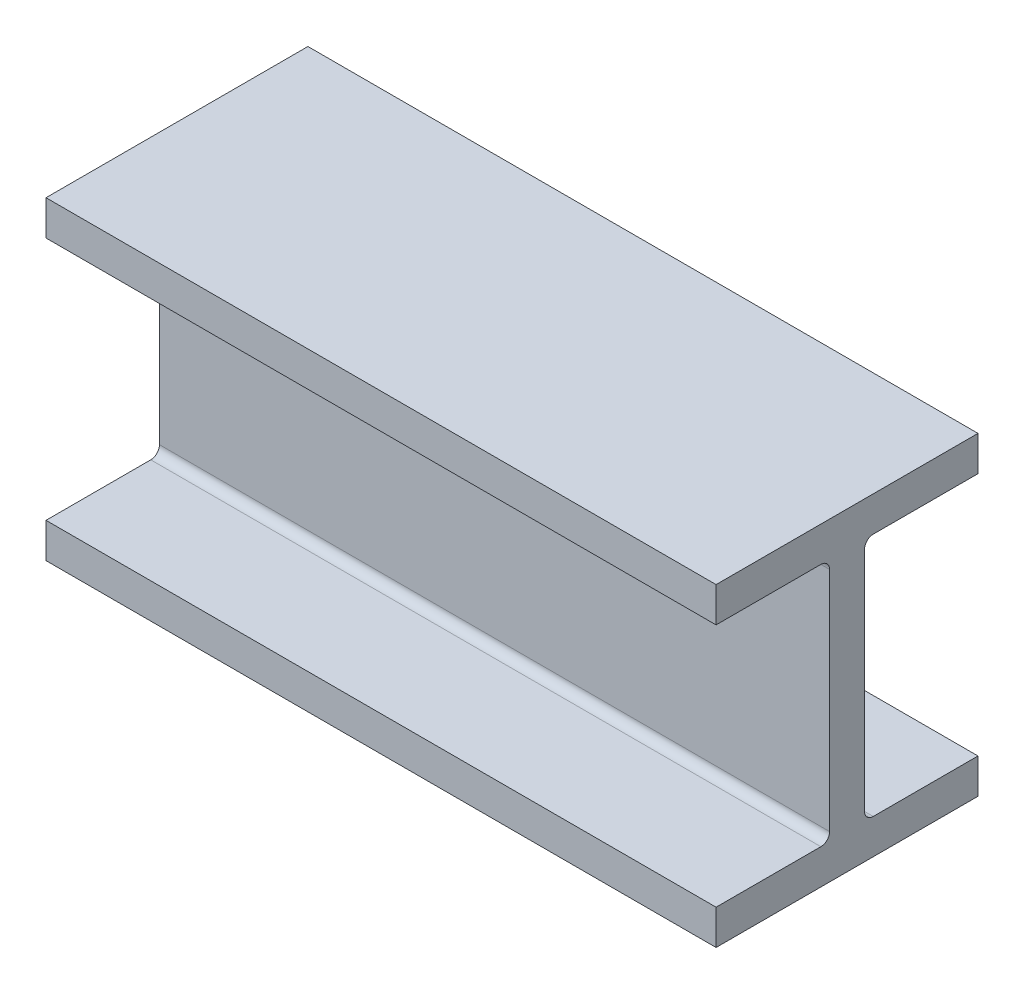
ISO-10303-21;
HEADER;
FILE_DESCRIPTION(('STEP AP214'),'2;1');
FILE_NAME('part.step','',(''),(''),'','','');
FILE_SCHEMA(('AUTOMOTIVE_DESIGN { 1 0 10303 214 1 1 1 1 }'));
ENDSEC;
DATA;
#1=APPLICATION_CONTEXT('core data for automotive mechanical design processes');
#2=APPLICATION_PROTOCOL_DEFINITION('international standard','automotive_design',2000,#1);
#3=PRODUCT_CONTEXT('',#1,'mechanical');
#4=PRODUCT('Part','Part','',(#3));
#5=PRODUCT_RELATED_PRODUCT_CATEGORY('part','',(#4));
#6=PRODUCT_DEFINITION_FORMATION('','',#4);
#7=PRODUCT_DEFINITION_CONTEXT('part definition',#1,'design');
#8=PRODUCT_DEFINITION('design','',#6,#7);
#9=PRODUCT_DEFINITION_SHAPE('','',#8);
#10=(LENGTH_UNIT() NAMED_UNIT(*) SI_UNIT(.MILLI.,.METRE.));
#11=(NAMED_UNIT(*) PLANE_ANGLE_UNIT() SI_UNIT($,.RADIAN.));
#12=(NAMED_UNIT(*) SI_UNIT($,.STERADIAN.) SOLID_ANGLE_UNIT());
#13=UNCERTAINTY_MEASURE_WITH_UNIT(LENGTH_MEASURE(1.E-05),#10,'distance_accuracy_value','');
#14=(GEOMETRIC_REPRESENTATION_CONTEXT(3) GLOBAL_UNCERTAINTY_ASSIGNED_CONTEXT((#13)) GLOBAL_UNIT_ASSIGNED_CONTEXT((#10,
#11,#12)) REPRESENTATION_CONTEXT('',''));
#15=CARTESIAN_POINT('',(0.,0.,0.));
#16=DIRECTION('',(0.,0.,1.));
#17=DIRECTION('',(1.,0.,0.));
#18=AXIS2_PLACEMENT_3D('',#15,#16,#17);
#19=CARTESIAN_POINT('',(1010.,2667.5,150.));
#20=DIRECTION('',(-1.,0.,0.));
#21=DIRECTION('',(0.,0.,1.));
#22=AXIS2_PLACEMENT_3D('',#19,#20,#21);
#23=PLANE('',#22);
#24=DIRECTION('',(0.,0.,1.));
#25=VECTOR('',#24,1.);
#26=CARTESIAN_POINT('',(1010.,2387.5,-20.));
#27=LINE('',#26,#25);
#28=CARTESIAN_POINT('',(1010.,2387.5,-150.));
#29=VERTEX_POINT('',#28);
#30=CARTESIAN_POINT('',(1010.,2387.5,-30.));
#31=VERTEX_POINT('',#30);
#32=EDGE_CURVE('E230',#29,#31,#27,.T.);
#33=ORIENTED_EDGE('',*,*,#32,.T.);
#34=CARTESIAN_POINT('',(1010.,2397.5,-30.));
#35=DIRECTION('',(1.,0.,0.));
#36=DIRECTION('',(0.,0.,-1.));
#37=AXIS2_PLACEMENT_3D('',#34,#35,#36);
#38=CIRCLE('',#37,10.);
#39=CARTESIAN_POINT('',(1010.,2397.5,-20.));
#40=VERTEX_POINT('',#39);
#41=EDGE_CURVE('E258',#31,#40,#38,.F.);
#42=ORIENTED_EDGE('',*,*,#41,.T.);
#43=DIRECTION('',(0.,1.,0.));
#44=VECTOR('',#43,1.);
#45=CARTESIAN_POINT('',(1010.,2387.5,-20.));
#46=LINE('',#45,#44);
#47=CARTESIAN_POINT('',(1010.,2657.5,-20.));
#48=VERTEX_POINT('',#47);
#49=EDGE_CURVE('E234',#40,#48,#46,.T.);
#50=ORIENTED_EDGE('',*,*,#49,.T.);
#51=CARTESIAN_POINT('',(1010.,2657.5,-30.));
#52=DIRECTION('',(1.,0.,0.));
#53=DIRECTION('',(0.,0.,-1.));
#54=AXIS2_PLACEMENT_3D('',#51,#52,#53);
#55=CIRCLE('',#54,10.);
#56=CARTESIAN_POINT('',(1010.,2667.5,-30.));
#57=VERTEX_POINT('',#56);
#58=EDGE_CURVE('E262',#48,#57,#55,.F.);
#59=ORIENTED_EDGE('',*,*,#58,.T.);
#60=DIRECTION('',(0.,0.,-1.));
#61=VECTOR('',#60,1.);
#62=CARTESIAN_POINT('',(1010.,2667.5,-20.));
#63=LINE('',#62,#61);
#64=CARTESIAN_POINT('',(1010.,2667.5,-150.));
#65=VERTEX_POINT('',#64);
#66=EDGE_CURVE('E238',#57,#65,#63,.T.);
#67=ORIENTED_EDGE('',*,*,#66,.T.);
#68=DIRECTION('',(0.,-1.,0.));
#69=VECTOR('',#68,1.);
#70=CARTESIAN_POINT('',(1010.,2347.5,-150.));
#71=LINE('',#70,#69);
#72=CARTESIAN_POINT('',(1010.,2707.5,-150.));
#73=VERTEX_POINT('',#72);
#74=EDGE_CURVE('E217',#73,#65,#71,.T.);
#75=ORIENTED_EDGE('',*,*,#74,.F.);
#76=DIRECTION('',(0.,0.,1.));
#77=VECTOR('',#76,1.);
#78=CARTESIAN_POINT('',(1010.,2707.5,150.));
#79=LINE('',#78,#77);
#80=CARTESIAN_POINT('',(1010.,2707.5,150.));
#81=VERTEX_POINT('',#80);
#82=EDGE_CURVE('E220',#73,#81,#79,.T.);
#83=ORIENTED_EDGE('',*,*,#82,.T.);
#84=DIRECTION('',(0.,1.,0.));
#85=VECTOR('',#84,1.);
#86=CARTESIAN_POINT('',(1010.,2347.5,150.));
#87=LINE('',#86,#85);
#88=CARTESIAN_POINT('',(1010.,2667.5,150.));
#89=VERTEX_POINT('',#88);
#90=EDGE_CURVE('E221',#89,#81,#87,.T.);
#91=ORIENTED_EDGE('',*,*,#90,.F.);
#92=DIRECTION('',(0.,0.,-1.));
#93=VECTOR('',#92,1.);
#94=CARTESIAN_POINT('',(1010.,2667.5,150.));
#95=LINE('',#94,#93);
#96=CARTESIAN_POINT('',(1010.,2667.5,30.));
#97=VERTEX_POINT('',#96);
#98=EDGE_CURVE('E242',#89,#97,#95,.T.);
#99=ORIENTED_EDGE('',*,*,#98,.T.);
#100=CARTESIAN_POINT('',(1010.,2657.5,30.));
#101=DIRECTION('',(1.,0.,0.));
#102=DIRECTION('',(0.,0.,-1.));
#103=AXIS2_PLACEMENT_3D('',#100,#101,#102);
#104=CIRCLE('',#103,10.);
#105=CARTESIAN_POINT('',(1010.,2657.5,20.));
#106=VERTEX_POINT('',#105);
#107=EDGE_CURVE('E265',#97,#106,#104,.F.);
#108=ORIENTED_EDGE('',*,*,#107,.T.);
#109=DIRECTION('',(0.,-1.,0.));
#110=VECTOR('',#109,1.);
#111=CARTESIAN_POINT('',(1010.,2387.5,20.));
#112=LINE('',#111,#110);
#113=CARTESIAN_POINT('',(1010.,2397.5,20.));
#114=VERTEX_POINT('',#113);
#115=EDGE_CURVE('E246',#106,#114,#112,.T.);
#116=ORIENTED_EDGE('',*,*,#115,.T.);
#117=CARTESIAN_POINT('',(1010.,2397.5,30.));
#118=DIRECTION('',(1.,0.,0.));
#119=DIRECTION('',(0.,0.,-1.));
#120=AXIS2_PLACEMENT_3D('',#117,#118,#119);
#121=CIRCLE('',#120,10.);
#122=CARTESIAN_POINT('',(1010.,2387.5,30.));
#123=VERTEX_POINT('',#122);
#124=EDGE_CURVE('E254',#114,#123,#121,.F.);
#125=ORIENTED_EDGE('',*,*,#124,.T.);
#126=DIRECTION('',(0.,0.,1.));
#127=VECTOR('',#126,1.);
#128=CARTESIAN_POINT('',(1010.,2387.5,150.));
#129=LINE('',#128,#127);
#130=CARTESIAN_POINT('',(1010.,2387.5,150.));
#131=VERTEX_POINT('',#130);
#132=EDGE_CURVE('E250',#123,#131,#129,.T.);
#133=ORIENTED_EDGE('',*,*,#132,.T.);
#134=CARTESIAN_POINT('',(1010.,2347.5,150.));
#135=VERTEX_POINT('',#134);
#136=EDGE_CURVE('E224',#135,#131,#87,.T.);
#137=ORIENTED_EDGE('',*,*,#136,.F.);
#138=DIRECTION('',(0.,0.,-1.));
#139=VECTOR('',#138,1.);
#140=CARTESIAN_POINT('',(1010.,2347.5,150.));
#141=LINE('',#140,#139);
#142=CARTESIAN_POINT('',(1010.,2347.5,-150.));
#143=VERTEX_POINT('',#142);
#144=EDGE_CURVE('E172',#135,#143,#141,.T.);
#145=ORIENTED_EDGE('',*,*,#144,.T.);
#146=EDGE_CURVE('E61',#29,#143,#71,.T.);
#147=ORIENTED_EDGE('',*,*,#146,.F.);
#148=EDGE_LOOP('',(#33,#42,#50,#59,#67,#75,#83,#91,#99,#108,#116,#125,#133,#137,#145,#147));
#149=FACE_BOUND('',#148,.T.);
#150=ADVANCED_FACE('F38',(#149),#23,.F.);
#151=CARTESIAN_POINT('',(1010.,2387.5,20.));
#152=DIRECTION('',(0.,0.,-1.));
#153=DIRECTION('',(-1.,0.,0.));
#154=AXIS2_PLACEMENT_3D('',#151,#152,#153);
#155=PLANE('',#154);
#156=DIRECTION('',(-1.,0.,0.));
#157=VECTOR('',#156,1.);
#158=CARTESIAN_POINT('',(160.,2657.5,20.));
#159=LINE('',#158,#157);
#160=CARTESIAN_POINT('',(242.5,2657.5,20.));
#161=VERTEX_POINT('',#160);
#162=EDGE_CURVE('E194',#106,#161,#159,.T.);
#163=ORIENTED_EDGE('',*,*,#162,.T.);
#164=DIRECTION('',(0.,-1.,0.));
#165=VECTOR('',#164,1.);
#166=CARTESIAN_POINT('',(242.5,2387.5,20.));
#167=LINE('',#166,#165);
#168=CARTESIAN_POINT('',(242.5,2397.5,20.));
#169=VERTEX_POINT('',#168);
#170=EDGE_CURVE('E303',#161,#169,#167,.T.);
#171=ORIENTED_EDGE('',*,*,#170,.T.);
#172=DIRECTION('',(-1.,0.,0.));
#173=VECTOR('',#172,1.);
#174=CARTESIAN_POINT('',(1010.,2397.5,20.));
#175=LINE('',#174,#173);
#176=EDGE_CURVE('E198',#169,#114,#175,.F.);
#177=ORIENTED_EDGE('',*,*,#176,.T.);
#178=ORIENTED_EDGE('',*,*,#115,.F.);
#179=EDGE_LOOP('',(#163,#171,#177,#178));
#180=FACE_BOUND('',#179,.T.);
#181=ADVANCED_FACE('F350',(#180),#155,.F.);
#182=CARTESIAN_POINT('',(1010.,2657.5,30.));
#183=DIRECTION('',(1.,0.,0.));
#184=DIRECTION('',(0.,0.,-1.));
#185=AXIS2_PLACEMENT_3D('',#182,#183,#184);
#186=CYLINDRICAL_SURFACE('',#185,10.);
#187=DIRECTION('',(-1.,0.,0.));
#188=VECTOR('',#187,1.);
#189=CARTESIAN_POINT('',(1010.,2667.5,30.));
#190=LINE('',#189,#188);
#191=CARTESIAN_POINT('',(242.5,2667.5,30.));
#192=VERTEX_POINT('',#191);
#193=EDGE_CURVE('E47',#192,#97,#190,.F.);
#194=ORIENTED_EDGE('',*,*,#193,.F.);
#195=CARTESIAN_POINT('',(242.5,2657.5,30.));
#196=DIRECTION('',(1.,0.,0.));
#197=DIRECTION('',(0.,0.,-1.));
#198=AXIS2_PLACEMENT_3D('',#195,#196,#197);
#199=CIRCLE('',#198,10.);
#200=EDGE_CURVE('E311',#192,#161,#199,.F.);
#201=ORIENTED_EDGE('',*,*,#200,.T.);
#202=ORIENTED_EDGE('',*,*,#162,.F.);
#203=ORIENTED_EDGE('',*,*,#107,.F.);
#204=EDGE_LOOP('',(#194,#201,#202,#203));
#205=FACE_BOUND('',#204,.T.);
#206=ADVANCED_FACE('F356',(#205),#186,.F.);
#207=CARTESIAN_POINT('',(160.,2347.5,150.));
#208=DIRECTION('',(0.,0.,-1.));
#209=DIRECTION('',(-1.,0.,0.));
#210=AXIS2_PLACEMENT_3D('',#207,#208,#209);
#211=PLANE('',#210);
#212=DIRECTION('',(-1.,0.,0.));
#213=VECTOR('',#212,1.);
#214=CARTESIAN_POINT('',(160.,2707.5,150.));
#215=LINE('',#214,#213);
#216=CARTESIAN_POINT('',(242.5,2707.5,150.));
#217=VERTEX_POINT('',#216);
#218=EDGE_CURVE('E175',#81,#217,#215,.T.);
#219=ORIENTED_EDGE('',*,*,#218,.T.);
#220=DIRECTION('',(0.,1.,0.));
#221=VECTOR('',#220,1.);
#222=CARTESIAN_POINT('',(242.5,2347.5,150.000000000001));
#223=LINE('',#222,#221);
#224=CARTESIAN_POINT('',(242.5,2667.5,150.));
#225=VERTEX_POINT('',#224);
#226=EDGE_CURVE('E158',#225,#217,#223,.T.);
#227=ORIENTED_EDGE('',*,*,#226,.F.);
#228=DIRECTION('',(-1.,0.,0.));
#229=VECTOR('',#228,1.);
#230=CARTESIAN_POINT('',(1010.,2667.5,150.));
#231=LINE('',#230,#229);
#232=EDGE_CURVE('E287',#89,#225,#231,.T.);
#233=ORIENTED_EDGE('',*,*,#232,.F.);
#234=ORIENTED_EDGE('',*,*,#90,.T.);
#235=EDGE_LOOP('',(#219,#227,#233,#234));
#236=FACE_BOUND('',#235,.T.);
#237=ADVANCED_FACE('F382',(#236),#211,.F.);
#238=CARTESIAN_POINT('',(1010.,2387.5,-20.));
#239=DIRECTION('',(0.,0.,1.));
#240=DIRECTION('',(1.,0.,0.));
#241=AXIS2_PLACEMENT_3D('',#238,#239,#240);
#242=PLANE('',#241);
#243=DIRECTION('',(-1.,0.,0.));
#244=VECTOR('',#243,1.);
#245=CARTESIAN_POINT('',(160.,2397.5,-20.));
#246=LINE('',#245,#244);
#247=CARTESIAN_POINT('',(242.5,2397.5,-20.));
#248=VERTEX_POINT('',#247);
#249=EDGE_CURVE('E204',#40,#248,#246,.T.);
#250=ORIENTED_EDGE('',*,*,#249,.T.);
#251=DIRECTION('',(0.,1.,0.));
#252=VECTOR('',#251,1.);
#253=CARTESIAN_POINT('',(242.5,2387.5,-20.));
#254=LINE('',#253,#252);
#255=CARTESIAN_POINT('',(242.5,2657.5,-20.));
#256=VERTEX_POINT('',#255);
#257=EDGE_CURVE('E281',#248,#256,#254,.T.);
#258=ORIENTED_EDGE('',*,*,#257,.T.);
#259=DIRECTION('',(-1.,0.,0.));
#260=VECTOR('',#259,1.);
#261=CARTESIAN_POINT('',(1010.,2657.5,-20.));
#262=LINE('',#261,#260);
#263=EDGE_CURVE('E201',#256,#48,#262,.F.);
#264=ORIENTED_EDGE('',*,*,#263,.T.);
#265=ORIENTED_EDGE('',*,*,#49,.F.);
#266=EDGE_LOOP('',(#250,#258,#264,#265));
#267=FACE_BOUND('',#266,.T.);
#268=ADVANCED_FACE('F330',(#267),#242,.F.);
#269=CARTESIAN_POINT('',(160.,2347.5,-150.));
#270=DIRECTION('',(0.,0.,1.));
#271=DIRECTION('',(1.,0.,0.));
#272=AXIS2_PLACEMENT_3D('',#269,#270,#271);
#273=PLANE('',#272);
#274=DIRECTION('',(-1.,0.,0.));
#275=VECTOR('',#274,1.);
#276=CARTESIAN_POINT('',(1010.,2667.5,-150.));
#277=LINE('',#276,#275);
#278=CARTESIAN_POINT('',(242.5,2667.5,-150.));
#279=VERTEX_POINT('',#278);
#280=EDGE_CURVE('E291',#65,#279,#277,.T.);
#281=ORIENTED_EDGE('',*,*,#280,.T.);
#282=DIRECTION('',(0.,1.,0.));
#283=VECTOR('',#282,1.);
#284=CARTESIAN_POINT('',(242.5,2347.5,-149.999999999999));
#285=LINE('',#284,#283);
#286=CARTESIAN_POINT('',(242.5,2707.5,-150.));
#287=VERTEX_POINT('',#286);
#288=EDGE_CURVE('E169',#279,#287,#285,.T.);
#289=ORIENTED_EDGE('',*,*,#288,.T.);
#290=DIRECTION('',(-1.,0.,0.));
#291=VECTOR('',#290,1.);
#292=CARTESIAN_POINT('',(160.,2707.5,-150.));
#293=LINE('',#292,#291);
#294=EDGE_CURVE('E181',#73,#287,#293,.T.);
#295=ORIENTED_EDGE('',*,*,#294,.F.);
#296=ORIENTED_EDGE('',*,*,#74,.T.);
#297=EDGE_LOOP('',(#281,#289,#295,#296));
#298=FACE_BOUND('',#297,.T.);
#299=ADVANCED_FACE('F340',(#298),#273,.F.);
#300=CARTESIAN_POINT('',(1010.,2397.5,-30.));
#301=DIRECTION('',(1.,0.,0.));
#302=DIRECTION('',(0.,0.,-1.));
#303=AXIS2_PLACEMENT_3D('',#300,#301,#302);
#304=CYLINDRICAL_SURFACE('',#303,10.);
#305=DIRECTION('',(-1.,0.,0.));
#306=VECTOR('',#305,1.);
#307=CARTESIAN_POINT('',(1010.,2387.5,-30.));
#308=LINE('',#307,#306);
#309=CARTESIAN_POINT('',(242.5,2387.5,-30.));
#310=VERTEX_POINT('',#309);
#311=EDGE_CURVE('E208',#310,#31,#308,.F.);
#312=ORIENTED_EDGE('',*,*,#311,.F.);
#313=CARTESIAN_POINT('',(242.5,2397.5,-30.));
#314=DIRECTION('',(1.,0.,0.));
#315=DIRECTION('',(0.,0.,-1.));
#316=AXIS2_PLACEMENT_3D('',#313,#314,#315);
#317=CIRCLE('',#316,10.);
#318=EDGE_CURVE('E274',#310,#248,#317,.F.);
#319=ORIENTED_EDGE('',*,*,#318,.T.);
#320=ORIENTED_EDGE('',*,*,#249,.F.);
#321=ORIENTED_EDGE('',*,*,#41,.F.);
#322=EDGE_LOOP('',(#312,#319,#320,#321));
#323=FACE_BOUND('',#322,.T.);
#324=ADVANCED_FACE('F338',(#323),#304,.F.);
#325=DIRECTION('',(-1.,0.,0.));
#326=VECTOR('',#325,1.);
#327=CARTESIAN_POINT('',(160.,2347.5,-150.));
#328=LINE('',#327,#326);
#329=CARTESIAN_POINT('',(242.5,2347.5,-149.999999999999));
#330=VERTEX_POINT('',#329);
#331=EDGE_CURVE('E176',#143,#330,#328,.T.);
#332=ORIENTED_EDGE('',*,*,#331,.T.);
#333=CARTESIAN_POINT('',(242.5,2387.5,-150.));
#334=VERTEX_POINT('',#333);
#335=EDGE_CURVE('E153',#330,#334,#285,.T.);
#336=ORIENTED_EDGE('',*,*,#335,.T.);
#337=DIRECTION('',(-1.,0.,0.));
#338=VECTOR('',#337,1.);
#339=CARTESIAN_POINT('',(1010.,2387.5,-150.));
#340=LINE('',#339,#338);
#341=EDGE_CURVE('E183',#29,#334,#340,.T.);
#342=ORIENTED_EDGE('',*,*,#341,.F.);
#343=ORIENTED_EDGE('',*,*,#146,.T.);
#344=EDGE_LOOP('',(#332,#336,#342,#343));
#345=FACE_BOUND('',#344,.T.);
#346=ADVANCED_FACE('F40',(#345),#273,.F.);
#347=DIRECTION('',(-1.,0.,0.));
#348=VECTOR('',#347,1.);
#349=CARTESIAN_POINT('',(1010.,2387.5,150.));
#350=LINE('',#349,#348);
#351=CARTESIAN_POINT('',(242.5,2387.5,150.));
#352=VERTEX_POINT('',#351);
#353=EDGE_CURVE('E167',#131,#352,#350,.T.);
#354=ORIENTED_EDGE('',*,*,#353,.T.);
#355=CARTESIAN_POINT('',(242.5,2347.5,150.000000000001));
#356=VERTEX_POINT('',#355);
#357=EDGE_CURVE('E54',#356,#352,#223,.T.);
#358=ORIENTED_EDGE('',*,*,#357,.F.);
#359=DIRECTION('',(-1.,0.,0.));
#360=VECTOR('',#359,1.);
#361=CARTESIAN_POINT('',(160.,2347.5,150.));
#362=LINE('',#361,#360);
#363=EDGE_CURVE('E165',#135,#356,#362,.T.);
#364=ORIENTED_EDGE('',*,*,#363,.F.);
#365=ORIENTED_EDGE('',*,*,#136,.T.);
#366=EDGE_LOOP('',(#354,#358,#364,#365));
#367=FACE_BOUND('',#366,.T.);
#368=ADVANCED_FACE('F164',(#367),#211,.F.);
#369=CARTESIAN_POINT('',(160.,2347.5,150.));
#370=DIRECTION('',(0.,1.,0.));
#371=DIRECTION('',(0.,0.,1.));
#372=AXIS2_PLACEMENT_3D('',#369,#370,#371);
#373=PLANE('',#372);
#374=ORIENTED_EDGE('',*,*,#363,.T.);
#375=DIRECTION('',(0.,0.,-1.));
#376=VECTOR('',#375,1.);
#377=CARTESIAN_POINT('',(242.5,2347.5,-149.999999999999));
#378=LINE('',#377,#376);
#379=EDGE_CURVE('E150',#356,#330,#378,.T.);
#380=ORIENTED_EDGE('',*,*,#379,.T.);
#381=ORIENTED_EDGE('',*,*,#331,.F.);
#382=ORIENTED_EDGE('',*,*,#144,.F.);
#383=EDGE_LOOP('',(#374,#380,#381,#382));
#384=FACE_BOUND('',#383,.T.);
#385=ADVANCED_FACE('F171',(#384),#373,.F.);
#386=CARTESIAN_POINT('',(1010.,2387.5,-20.));
#387=DIRECTION('',(0.,-1.,0.));
#388=DIRECTION('',(0.,0.,-1.));
#389=AXIS2_PLACEMENT_3D('',#386,#387,#388);
#390=PLANE('',#389);
#391=ORIENTED_EDGE('',*,*,#341,.T.);
#392=DIRECTION('',(0.,0.,1.));
#393=VECTOR('',#392,1.);
#394=CARTESIAN_POINT('',(242.5,2387.5,-19.9999999999998));
#395=LINE('',#394,#393);
#396=EDGE_CURVE('E268',#334,#310,#395,.T.);
#397=ORIENTED_EDGE('',*,*,#396,.T.);
#398=ORIENTED_EDGE('',*,*,#311,.T.);
#399=ORIENTED_EDGE('',*,*,#32,.F.);
#400=EDGE_LOOP('',(#391,#397,#398,#399));
#401=FACE_BOUND('',#400,.T.);
#402=ADVANCED_FACE('F296',(#401),#390,.F.);
#403=CARTESIAN_POINT('',(1010.,2657.5,-30.));
#404=DIRECTION('',(1.,0.,0.));
#405=DIRECTION('',(0.,0.,-1.));
#406=AXIS2_PLACEMENT_3D('',#403,#404,#405);
#407=CYLINDRICAL_SURFACE('',#406,10.);
#408=ORIENTED_EDGE('',*,*,#263,.F.);
#409=CARTESIAN_POINT('',(242.5,2657.5,-30.));
#410=DIRECTION('',(1.,0.,0.));
#411=DIRECTION('',(0.,0.,-1.));
#412=AXIS2_PLACEMENT_3D('',#409,#410,#411);
#413=CIRCLE('',#412,10.);
#414=CARTESIAN_POINT('',(242.5,2667.5,-30.));
#415=VERTEX_POINT('',#414);
#416=EDGE_CURVE('E323',#256,#415,#413,.F.);
#417=ORIENTED_EDGE('',*,*,#416,.T.);
#418=DIRECTION('',(-1.,0.,0.));
#419=VECTOR('',#418,1.);
#420=CARTESIAN_POINT('',(160.,2667.5,-30.));
#421=LINE('',#420,#419);
#422=EDGE_CURVE('E211',#57,#415,#421,.T.);
#423=ORIENTED_EDGE('',*,*,#422,.F.);
#424=ORIENTED_EDGE('',*,*,#58,.F.);
#425=EDGE_LOOP('',(#408,#417,#423,#424));
#426=FACE_BOUND('',#425,.T.);
#427=ADVANCED_FACE('F334',(#426),#407,.F.);
#428=CARTESIAN_POINT('',(1010.,2667.5,-20.));
#429=DIRECTION('',(0.,1.,0.));
#430=DIRECTION('',(0.,0.,1.));
#431=AXIS2_PLACEMENT_3D('',#428,#429,#430);
#432=PLANE('',#431);
#433=ORIENTED_EDGE('',*,*,#422,.T.);
#434=DIRECTION('',(0.,0.,-1.));
#435=VECTOR('',#434,1.);
#436=CARTESIAN_POINT('',(242.5,2667.5,-19.9999999999998));
#437=LINE('',#436,#435);
#438=EDGE_CURVE('E319',#415,#279,#437,.T.);
#439=ORIENTED_EDGE('',*,*,#438,.T.);
#440=ORIENTED_EDGE('',*,*,#280,.F.);
#441=ORIENTED_EDGE('',*,*,#66,.F.);
#442=EDGE_LOOP('',(#433,#439,#440,#441));
#443=FACE_BOUND('',#442,.T.);
#444=ADVANCED_FACE('F376',(#443),#432,.F.);
#445=CARTESIAN_POINT('',(160.,2707.5,150.));
#446=DIRECTION('',(0.,-1.,0.));
#447=DIRECTION('',(0.,0.,-1.));
#448=AXIS2_PLACEMENT_3D('',#445,#446,#447);
#449=PLANE('',#448);
#450=ORIENTED_EDGE('',*,*,#294,.T.);
#451=DIRECTION('',(0.,0.,-1.));
#452=VECTOR('',#451,1.);
#453=CARTESIAN_POINT('',(242.5,2707.5,-150.));
#454=LINE('',#453,#452);
#455=EDGE_CURVE('E159',#217,#287,#454,.T.);
#456=ORIENTED_EDGE('',*,*,#455,.F.);
#457=ORIENTED_EDGE('',*,*,#218,.F.);
#458=ORIENTED_EDGE('',*,*,#82,.F.);
#459=EDGE_LOOP('',(#450,#456,#457,#458));
#460=FACE_BOUND('',#459,.T.);
#461=ADVANCED_FACE('F374',(#460),#449,.F.);
#462=CARTESIAN_POINT('',(1010.,2667.5,150.));
#463=DIRECTION('',(0.,1.,0.));
#464=DIRECTION('',(0.,0.,1.));
#465=AXIS2_PLACEMENT_3D('',#462,#463,#464);
#466=PLANE('',#465);
#467=ORIENTED_EDGE('',*,*,#232,.T.);
#468=DIRECTION('',(0.,0.,-1.));
#469=VECTOR('',#468,1.);
#470=CARTESIAN_POINT('',(242.5,2667.5,150.));
#471=LINE('',#470,#469);
#472=EDGE_CURVE('E315',#225,#192,#471,.T.);
#473=ORIENTED_EDGE('',*,*,#472,.T.);
#474=ORIENTED_EDGE('',*,*,#193,.T.);
#475=ORIENTED_EDGE('',*,*,#98,.F.);
#476=EDGE_LOOP('',(#467,#473,#474,#475));
#477=FACE_BOUND('',#476,.T.);
#478=ADVANCED_FACE('F369',(#477),#466,.F.);
#479=CARTESIAN_POINT('',(1010.,2397.5,30.));
#480=DIRECTION('',(1.,0.,0.));
#481=DIRECTION('',(0.,0.,-1.));
#482=AXIS2_PLACEMENT_3D('',#479,#480,#481);
#483=CYLINDRICAL_SURFACE('',#482,10.);
#484=ORIENTED_EDGE('',*,*,#176,.F.);
#485=CARTESIAN_POINT('',(242.5,2397.5,30.));
#486=DIRECTION('',(1.,0.,0.));
#487=DIRECTION('',(0.,0.,-1.));
#488=AXIS2_PLACEMENT_3D('',#485,#486,#487);
#489=CIRCLE('',#488,10.);
#490=CARTESIAN_POINT('',(242.5,2387.5,30.));
#491=VERTEX_POINT('',#490);
#492=EDGE_CURVE('E298',#169,#491,#489,.F.);
#493=ORIENTED_EDGE('',*,*,#492,.T.);
#494=DIRECTION('',(-1.,0.,0.));
#495=VECTOR('',#494,1.);
#496=CARTESIAN_POINT('',(160.,2387.5,30.));
#497=LINE('',#496,#495);
#498=EDGE_CURVE('E190',#123,#491,#497,.T.);
#499=ORIENTED_EDGE('',*,*,#498,.F.);
#500=ORIENTED_EDGE('',*,*,#124,.F.);
#501=EDGE_LOOP('',(#484,#493,#499,#500));
#502=FACE_BOUND('',#501,.T.);
#503=ADVANCED_FACE('F361',(#502),#483,.F.);
#504=CARTESIAN_POINT('',(1010.,2387.5,150.));
#505=DIRECTION('',(0.,-1.,0.));
#506=DIRECTION('',(0.,0.,-1.));
#507=AXIS2_PLACEMENT_3D('',#504,#505,#506);
#508=PLANE('',#507);
#509=ORIENTED_EDGE('',*,*,#498,.T.);
#510=DIRECTION('',(0.,0.,1.));
#511=VECTOR('',#510,1.);
#512=CARTESIAN_POINT('',(242.5,2387.5,150.));
#513=LINE('',#512,#511);
#514=EDGE_CURVE('E11',#491,#352,#513,.T.);
#515=ORIENTED_EDGE('',*,*,#514,.T.);
#516=ORIENTED_EDGE('',*,*,#353,.F.);
#517=ORIENTED_EDGE('',*,*,#132,.F.);
#518=EDGE_LOOP('',(#509,#515,#516,#517));
#519=FACE_BOUND('',#518,.T.);
#520=ADVANCED_FACE('F352',(#519),#508,.F.);
#521=CARTESIAN_POINT('',(242.5,2347.5,-149.999999999999));
#522=DIRECTION('',(1.,0.,0.));
#523=DIRECTION('',(0.,0.,-1.));
#524=AXIS2_PLACEMENT_3D('',#521,#522,#523);
#525=PLANE('',#524);
#526=ORIENTED_EDGE('',*,*,#335,.F.);
#527=ORIENTED_EDGE('',*,*,#379,.F.);
#528=ORIENTED_EDGE('',*,*,#357,.T.);
#529=ORIENTED_EDGE('',*,*,#514,.F.);
#530=ORIENTED_EDGE('',*,*,#492,.F.);
#531=ORIENTED_EDGE('',*,*,#170,.F.);
#532=ORIENTED_EDGE('',*,*,#200,.F.);
#533=ORIENTED_EDGE('',*,*,#472,.F.);
#534=ORIENTED_EDGE('',*,*,#226,.T.);
#535=ORIENTED_EDGE('',*,*,#455,.T.);
#536=ORIENTED_EDGE('',*,*,#288,.F.);
#537=ORIENTED_EDGE('',*,*,#438,.F.);
#538=ORIENTED_EDGE('',*,*,#416,.F.);
#539=ORIENTED_EDGE('',*,*,#257,.F.);
#540=ORIENTED_EDGE('',*,*,#318,.F.);
#541=ORIENTED_EDGE('',*,*,#396,.F.);
#542=EDGE_LOOP('',(#526,#527,#528,#529,#530,#531,#532,#533,#534,#535,#536,#537,#538,#539,#540,#541));
#543=FACE_BOUND('',#542,.T.);
#544=ADVANCED_FACE('F151',(#543),#525,.F.);
#545=CLOSED_SHELL('',(#150,#181,#206,#237,#268,#299,#324,#346,#368,#385,#402,#427,#444,#461,
#478,#503,#520,#544));
#546=MANIFOLD_SOLID_BREP('B2',#545);
#547=ADVANCED_BREP_SHAPE_REPRESENTATION('',(#18,#546),#14);
#548=SHAPE_DEFINITION_REPRESENTATION(#9,#547);
ENDSEC;
END-ISO-10303-21;
